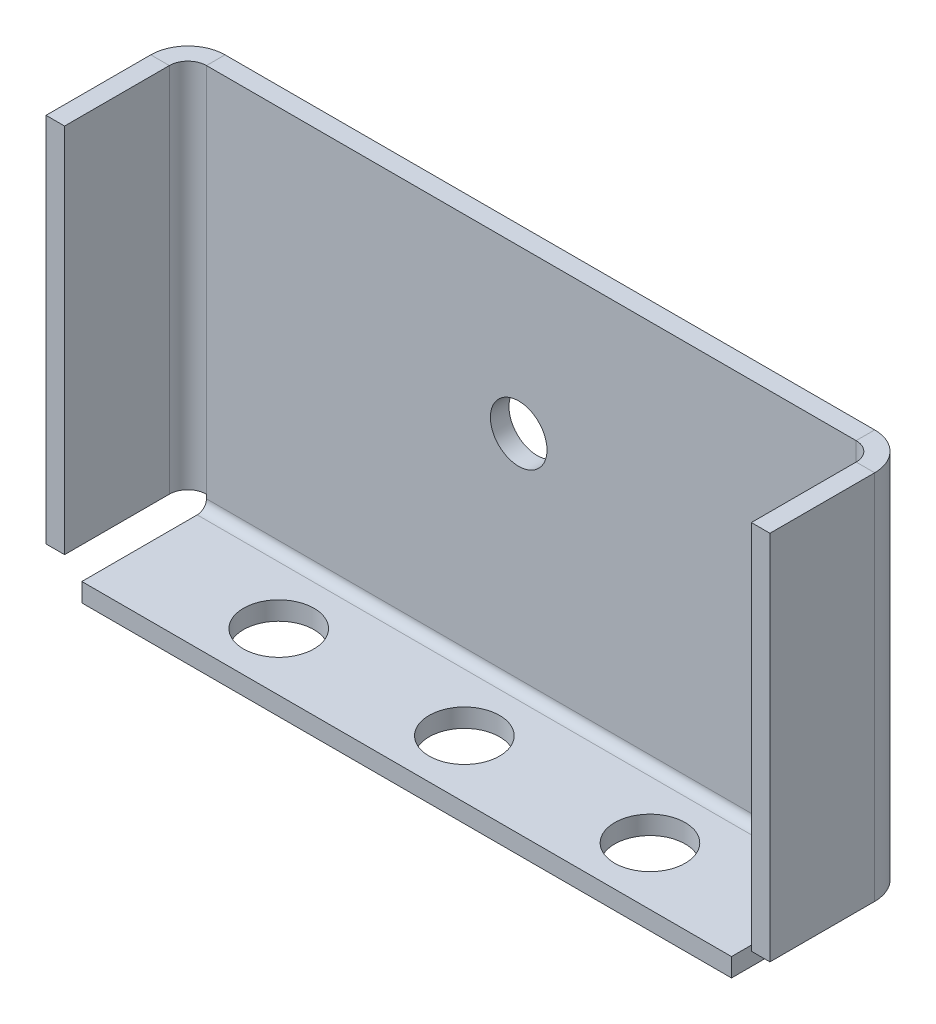
ISO-10303-21;
HEADER;
FILE_DESCRIPTION(('STEP AP214'),'2;1');
FILE_NAME('part.step','',(''),(''),'','','');
FILE_SCHEMA(('AUTOMOTIVE_DESIGN { 1 0 10303 214 1 1 1 1 }'));
ENDSEC;
DATA;
#1=APPLICATION_CONTEXT('core data for automotive mechanical design processes');
#2=APPLICATION_PROTOCOL_DEFINITION('international standard','automotive_design',2000,#1);
#3=PRODUCT_CONTEXT('',#1,'mechanical');
#4=PRODUCT('Part','Part','',(#3));
#5=PRODUCT_RELATED_PRODUCT_CATEGORY('part','',(#4));
#6=PRODUCT_DEFINITION_FORMATION('','',#4);
#7=PRODUCT_DEFINITION_CONTEXT('part definition',#1,'design');
#8=PRODUCT_DEFINITION('design','',#6,#7);
#9=PRODUCT_DEFINITION_SHAPE('','',#8);
#10=(LENGTH_UNIT() NAMED_UNIT(*) SI_UNIT(.MILLI.,.METRE.));
#11=(NAMED_UNIT(*) PLANE_ANGLE_UNIT() SI_UNIT($,.RADIAN.));
#12=(NAMED_UNIT(*) SI_UNIT($,.STERADIAN.) SOLID_ANGLE_UNIT());
#13=UNCERTAINTY_MEASURE_WITH_UNIT(LENGTH_MEASURE(1.E-05),#10,'distance_accuracy_value','');
#14=(GEOMETRIC_REPRESENTATION_CONTEXT(3) GLOBAL_UNCERTAINTY_ASSIGNED_CONTEXT((#13)) GLOBAL_UNIT_ASSIGNED_CONTEXT((#10,
#11,#12)) REPRESENTATION_CONTEXT('',''));
#15=CARTESIAN_POINT('',(0.,0.,0.));
#16=DIRECTION('',(0.,0.,1.));
#17=DIRECTION('',(1.,0.,0.));
#18=AXIS2_PLACEMENT_3D('',#15,#16,#17);
#19=CARTESIAN_POINT('',(0.,0.,-1.));
#20=DIRECTION('',(0.,0.,1.));
#21=DIRECTION('',(1.,0.,0.));
#22=AXIS2_PLACEMENT_3D('',#19,#20,#21);
#23=PLANE('',#22);
#24=CARTESIAN_POINT('',(-0.679999999999993,1.23539816339747,-0.999999999999999));
#25=DIRECTION('',(0.,0.,1.));
#26=DIRECTION('',(1.,0.,0.));
#27=AXIS2_PLACEMENT_3D('',#24,#25,#26);
#28=CIRCLE('',#27,1.525);
#29=CARTESIAN_POINT('',(0.845000000000007,1.23539816339747,-0.999999999999999));
#30=VERTEX_POINT('',#29);
#31=EDGE_CURVE('E432',#30,#30,#28,.T.);
#32=ORIENTED_EDGE('',*,*,#31,.T.);
#33=EDGE_LOOP('',(#32));
#34=FACE_BOUND('',#33,.T.);
#35=DIRECTION('',(0.,1.,0.));
#36=VECTOR('',#35,1.);
#37=CARTESIAN_POINT('',(17.5,-10.,-1.));
#38=LINE('',#37,#36);
#39=CARTESIAN_POINT('',(17.5,-10.2146018366026,-1.));
#40=VERTEX_POINT('',#39);
#41=CARTESIAN_POINT('',(17.5,-9.99999999999999,-1.));
#42=VERTEX_POINT('',#41);
#43=EDGE_CURVE('E53',#40,#42,#38,.T.);
#44=ORIENTED_EDGE('',*,*,#43,.F.);
#45=DIRECTION('',(-1.,0.,0.));
#46=VECTOR('',#45,1.);
#47=CARTESIAN_POINT('',(0.,-10.2146018366025,-1.));
#48=LINE('',#47,#46);
#49=CARTESIAN_POINT('',(-17.5,-10.2146018366026,-1.));
#50=VERTEX_POINT('',#49);
#51=EDGE_CURVE('E325',#40,#50,#48,.T.);
#52=ORIENTED_EDGE('',*,*,#51,.T.);
#53=DIRECTION('',(0.,-1.,0.));
#54=VECTOR('',#53,1.);
#55=CARTESIAN_POINT('',(-17.5,-10.,-1.));
#56=LINE('',#55,#54);
#57=CARTESIAN_POINT('',(-17.5,-10.,-1.));
#58=VERTEX_POINT('',#57);
#59=EDGE_CURVE('E331',#58,#50,#56,.T.);
#60=ORIENTED_EDGE('',*,*,#59,.F.);
#61=DIRECTION('',(0.,-1.,0.));
#62=VECTOR('',#61,1.);
#63=CARTESIAN_POINT('',(-17.5,0.,-1.));
#64=LINE('',#63,#62);
#65=CARTESIAN_POINT('',(-17.5,9.99999999999999,-1.));
#66=VERTEX_POINT('',#65);
#67=EDGE_CURVE('E306',#66,#58,#64,.T.);
#68=ORIENTED_EDGE('',*,*,#67,.F.);
#69=DIRECTION('',(-1.,0.,0.));
#70=VECTOR('',#69,1.);
#71=CARTESIAN_POINT('',(-25.5,10.,-1.));
#72=LINE('',#71,#70);
#73=CARTESIAN_POINT('',(17.5,10.,-1.));
#74=VERTEX_POINT('',#73);
#75=EDGE_CURVE('E328',#74,#66,#72,.T.);
#76=ORIENTED_EDGE('',*,*,#75,.F.);
#77=DIRECTION('',(0.,-1.,0.));
#78=VECTOR('',#77,1.);
#79=CARTESIAN_POINT('',(17.5,0.,-1.));
#80=LINE('',#79,#78);
#81=EDGE_CURVE('E315',#74,#42,#80,.T.);
#82=ORIENTED_EDGE('',*,*,#81,.T.);
#83=EDGE_LOOP('',(#44,#52,#60,#68,#76,#82));
#84=FACE_BOUND('',#83,.T.);
#85=ADVANCED_FACE('F49',(#34,#84),#23,.F.);
#86=CARTESIAN_POINT('',(0.,0.,0.));
#87=DIRECTION('',(0.,0.,1.));
#88=DIRECTION('',(1.,0.,0.));
#89=AXIS2_PLACEMENT_3D('',#86,#87,#88);
#90=PLANE('',#89);
#91=CARTESIAN_POINT('',(-0.679999999999993,1.23539816339747,0.));
#92=DIRECTION('',(0.,0.,1.));
#93=DIRECTION('',(1.,0.,0.));
#94=AXIS2_PLACEMENT_3D('',#91,#92,#93);
#95=CIRCLE('',#94,1.525);
#96=CARTESIAN_POINT('',(0.845000000000007,1.23539816339747,0.));
#97=VERTEX_POINT('',#96);
#98=EDGE_CURVE('E435',#97,#97,#95,.T.);
#99=ORIENTED_EDGE('',*,*,#98,.F.);
#100=EDGE_LOOP('',(#99));
#101=FACE_BOUND('',#100,.T.);
#102=DIRECTION('',(-1.,0.,0.));
#103=VECTOR('',#102,1.);
#104=CARTESIAN_POINT('',(0.,-10.2146018366026,0.));
#105=LINE('',#104,#103);
#106=CARTESIAN_POINT('',(17.5,-10.2146018366026,0.));
#107=VERTEX_POINT('',#106);
#108=CARTESIAN_POINT('',(-17.5,-10.2146018366026,0.));
#109=VERTEX_POINT('',#108);
#110=EDGE_CURVE('E58',#107,#109,#105,.T.);
#111=ORIENTED_EDGE('',*,*,#110,.F.);
#112=DIRECTION('',(0.,1.,0.));
#113=VECTOR('',#112,1.);
#114=CARTESIAN_POINT('',(17.5,-10.,0.));
#115=LINE('',#114,#113);
#116=CARTESIAN_POINT('',(17.5,-10.,0.));
#117=VERTEX_POINT('',#116);
#118=EDGE_CURVE('E74',#107,#117,#115,.T.);
#119=ORIENTED_EDGE('',*,*,#118,.T.);
#120=DIRECTION('',(0.,-1.,0.));
#121=VECTOR('',#120,1.);
#122=CARTESIAN_POINT('',(17.5,0.,0.));
#123=LINE('',#122,#121);
#124=CARTESIAN_POINT('',(17.5,10.,0.));
#125=VERTEX_POINT('',#124);
#126=EDGE_CURVE('E320',#125,#117,#123,.T.);
#127=ORIENTED_EDGE('',*,*,#126,.F.);
#128=DIRECTION('',(-1.,0.,0.));
#129=VECTOR('',#128,1.);
#130=CARTESIAN_POINT('',(-25.5,10.,0.));
#131=LINE('',#130,#129);
#132=CARTESIAN_POINT('',(-17.5,10.,0.));
#133=VERTEX_POINT('',#132);
#134=EDGE_CURVE('E302',#125,#133,#131,.T.);
#135=ORIENTED_EDGE('',*,*,#134,.T.);
#136=DIRECTION('',(0.,-1.,0.));
#137=VECTOR('',#136,1.);
#138=CARTESIAN_POINT('',(-17.5,0.,0.));
#139=LINE('',#138,#137);
#140=CARTESIAN_POINT('',(-17.5,-10.,0.));
#141=VERTEX_POINT('',#140);
#142=EDGE_CURVE('E310',#133,#141,#139,.T.);
#143=ORIENTED_EDGE('',*,*,#142,.T.);
#144=DIRECTION('',(0.,-1.,0.));
#145=VECTOR('',#144,1.);
#146=CARTESIAN_POINT('',(-17.5,-10.,0.));
#147=LINE('',#146,#145);
#148=EDGE_CURVE('E66',#141,#109,#147,.T.);
#149=ORIENTED_EDGE('',*,*,#148,.T.);
#150=EDGE_LOOP('',(#111,#119,#127,#135,#143,#149));
#151=FACE_BOUND('',#150,.T.);
#152=ADVANCED_FACE('F341',(#101,#151),#90,.T.);
#153=CARTESIAN_POINT('',(-25.5,10.,-1.));
#154=DIRECTION('',(0.,1.,0.));
#155=DIRECTION('',(0.,0.,1.));
#156=AXIS2_PLACEMENT_3D('',#153,#154,#155);
#157=PLANE('',#156);
#158=DIRECTION('',(0.,0.,1.));
#159=VECTOR('',#158,1.);
#160=CARTESIAN_POINT('',(17.5,10.,-1.));
#161=LINE('',#160,#159);
#162=EDGE_CURVE('E318',#74,#125,#161,.T.);
#163=ORIENTED_EDGE('',*,*,#162,.F.);
#164=ORIENTED_EDGE('',*,*,#75,.T.);
#165=DIRECTION('',(0.,0.,1.));
#166=VECTOR('',#165,1.);
#167=CARTESIAN_POINT('',(-17.5,10.,-1.));
#168=LINE('',#167,#166);
#169=EDGE_CURVE('E312',#66,#133,#168,.T.);
#170=ORIENTED_EDGE('',*,*,#169,.T.);
#171=ORIENTED_EDGE('',*,*,#134,.F.);
#172=EDGE_LOOP('',(#163,#164,#170,#171));
#173=FACE_BOUND('',#172,.T.);
#174=ADVANCED_FACE('F376',(#173),#157,.T.);
#175=CARTESIAN_POINT('',(17.5,-10.,-1.));
#176=DIRECTION('',(1.,0.,0.));
#177=DIRECTION('',(0.,1.,0.));
#178=AXIS2_PLACEMENT_3D('',#175,#176,#177);
#179=PLANE('',#178);
#180=DIRECTION('',(0.,0.,1.));
#181=VECTOR('',#180,1.);
#182=CARTESIAN_POINT('',(17.5,-10.2146018366025,-1.));
#183=LINE('',#182,#181);
#184=EDGE_CURVE('E334',#40,#107,#183,.T.);
#185=ORIENTED_EDGE('',*,*,#184,.F.);
#186=ORIENTED_EDGE('',*,*,#43,.T.);
#187=DIRECTION('',(0.,0.,1.));
#188=VECTOR('',#187,1.);
#189=CARTESIAN_POINT('',(17.5,-10.,-1.));
#190=LINE('',#189,#188);
#191=EDGE_CURVE('E323',#42,#117,#190,.T.);
#192=ORIENTED_EDGE('',*,*,#191,.T.);
#193=ORIENTED_EDGE('',*,*,#118,.F.);
#194=EDGE_LOOP('',(#185,#186,#192,#193));
#195=FACE_BOUND('',#194,.T.);
#196=ADVANCED_FACE('F353',(#195),#179,.T.);
#197=CARTESIAN_POINT('',(-17.5,-10.,-1.));
#198=DIRECTION('',(-1.,0.,0.));
#199=DIRECTION('',(0.,-1.,0.));
#200=AXIS2_PLACEMENT_3D('',#197,#198,#199);
#201=PLANE('',#200);
#202=DIRECTION('',(0.,0.,-1.));
#203=VECTOR('',#202,1.);
#204=CARTESIAN_POINT('',(-17.5,-10.2146018366025,-1.));
#205=LINE('',#204,#203);
#206=EDGE_CURVE('E12',#109,#50,#205,.T.);
#207=ORIENTED_EDGE('',*,*,#206,.F.);
#208=ORIENTED_EDGE('',*,*,#148,.F.);
#209=DIRECTION('',(0.,0.,1.));
#210=VECTOR('',#209,1.);
#211=CARTESIAN_POINT('',(-17.5,-10.,-1.));
#212=LINE('',#211,#210);
#213=EDGE_CURVE('E308',#58,#141,#212,.T.);
#214=ORIENTED_EDGE('',*,*,#213,.F.);
#215=ORIENTED_EDGE('',*,*,#59,.T.);
#216=EDGE_LOOP('',(#207,#208,#214,#215));
#217=FACE_BOUND('',#216,.T.);
#218=ADVANCED_FACE('F51',(#217),#201,.T.);
#219=CARTESIAN_POINT('',(-17.5,9.99999999999999,1.));
#220=DIRECTION('',(0.,1.,0.));
#221=DIRECTION('',(0.,0.,1.));
#222=AXIS2_PLACEMENT_3D('',#219,#220,#221);
#223=PLANE('',#222);
#224=DIRECTION('',(1.,0.,0.));
#225=VECTOR('',#224,1.);
#226=CARTESIAN_POINT('',(-19.5,10.,1.00000000000001));
#227=LINE('',#226,#225);
#228=CARTESIAN_POINT('',(-19.5,9.99999999999999,1.00000000000001));
#229=VERTEX_POINT('',#228);
#230=CARTESIAN_POINT('',(-18.5,10.,1.));
#231=VERTEX_POINT('',#230);
#232=EDGE_CURVE('E259',#229,#231,#227,.T.);
#233=ORIENTED_EDGE('',*,*,#232,.T.);
#234=CARTESIAN_POINT('',(-17.5,9.99999999999998,1.));
#235=DIRECTION('',(0.,1.,0.));
#236=DIRECTION('',(0.,0.,1.));
#237=AXIS2_PLACEMENT_3D('',#234,#235,#236);
#238=CIRCLE('',#237,1.);
#239=EDGE_CURVE('E267',#231,#133,#238,.F.);
#240=ORIENTED_EDGE('',*,*,#239,.T.);
#241=ORIENTED_EDGE('',*,*,#169,.F.);
#242=CARTESIAN_POINT('',(-17.5,9.99999999999999,1.));
#243=DIRECTION('',(0.,-1.,0.));
#244=DIRECTION('',(0.,0.,1.));
#245=AXIS2_PLACEMENT_3D('',#242,#243,#244);
#246=CIRCLE('',#245,2.);
#247=EDGE_CURVE('E295',#229,#66,#246,.T.);
#248=ORIENTED_EDGE('',*,*,#247,.F.);
#249=EDGE_LOOP('',(#233,#240,#241,#248));
#250=FACE_BOUND('',#249,.T.);
#251=ADVANCED_FACE('F457',(#250),#223,.T.);
#252=CARTESIAN_POINT('',(-17.5,-10.,1.));
#253=DIRECTION('',(0.,-1.,0.));
#254=DIRECTION('',(0.,0.,-1.));
#255=AXIS2_PLACEMENT_3D('',#252,#253,#254);
#256=PLANE('',#255);
#257=CARTESIAN_POINT('',(-17.5,-10.,1.));
#258=DIRECTION('',(0.,1.,0.));
#259=DIRECTION('',(0.,0.,1.));
#260=AXIS2_PLACEMENT_3D('',#257,#258,#259);
#261=CIRCLE('',#260,1.);
#262=CARTESIAN_POINT('',(-18.5,-10.,1.));
#263=VERTEX_POINT('',#262);
#264=EDGE_CURVE('E299',#141,#263,#261,.T.);
#265=ORIENTED_EDGE('',*,*,#264,.T.);
#266=DIRECTION('',(-1.,0.,0.));
#267=VECTOR('',#266,1.);
#268=CARTESIAN_POINT('',(-19.5,-10.,1.00000000000001));
#269=LINE('',#268,#267);
#270=CARTESIAN_POINT('',(-19.5,-10.,1.00000000000001));
#271=VERTEX_POINT('',#270);
#272=EDGE_CURVE('E287',#263,#271,#269,.T.);
#273=ORIENTED_EDGE('',*,*,#272,.T.);
#274=CARTESIAN_POINT('',(-17.5,-10.,1.));
#275=DIRECTION('',(0.,1.,0.));
#276=DIRECTION('',(0.,0.,-1.));
#277=AXIS2_PLACEMENT_3D('',#274,#275,#276);
#278=CIRCLE('',#277,2.);
#279=EDGE_CURVE('E298',#58,#271,#278,.T.);
#280=ORIENTED_EDGE('',*,*,#279,.F.);
#281=ORIENTED_EDGE('',*,*,#213,.T.);
#282=EDGE_LOOP('',(#265,#273,#280,#281));
#283=FACE_BOUND('',#282,.T.);
#284=ADVANCED_FACE('F453',(#283),#256,.T.);
#285=CARTESIAN_POINT('',(-17.5,-20.1631260591113,1.));
#286=DIRECTION('',(0.,1.,0.));
#287=DIRECTION('',(0.,0.,1.));
#288=AXIS2_PLACEMENT_3D('',#285,#286,#287);
#289=CYLINDRICAL_SURFACE('',#288,2.);
#290=ORIENTED_EDGE('',*,*,#67,.T.);
#291=ORIENTED_EDGE('',*,*,#279,.T.);
#292=DIRECTION('',(0.,-1.,0.));
#293=VECTOR('',#292,1.);
#294=CARTESIAN_POINT('',(-19.5,0.,1.00000000000001));
#295=LINE('',#294,#293);
#296=EDGE_CURVE('E280',#229,#271,#295,.T.);
#297=ORIENTED_EDGE('',*,*,#296,.F.);
#298=ORIENTED_EDGE('',*,*,#247,.T.);
#299=EDGE_LOOP('',(#290,#291,#297,#298));
#300=FACE_BOUND('',#299,.T.);
#301=ADVANCED_FACE('F456',(#300),#289,.T.);
#302=CARTESIAN_POINT('',(-17.5,-20.1631260591113,1.));
#303=DIRECTION('',(0.,1.,0.));
#304=DIRECTION('',(0.,0.,1.));
#305=AXIS2_PLACEMENT_3D('',#302,#303,#304);
#306=CYLINDRICAL_SURFACE('',#305,1.);
#307=ORIENTED_EDGE('',*,*,#142,.F.);
#308=ORIENTED_EDGE('',*,*,#239,.F.);
#309=DIRECTION('',(0.,-1.,0.));
#310=VECTOR('',#309,1.);
#311=CARTESIAN_POINT('',(-18.5,0.,1.));
#312=LINE('',#311,#310);
#313=EDGE_CURVE('E290',#231,#263,#312,.T.);
#314=ORIENTED_EDGE('',*,*,#313,.T.);
#315=ORIENTED_EDGE('',*,*,#264,.F.);
#316=EDGE_LOOP('',(#307,#308,#314,#315));
#317=FACE_BOUND('',#316,.T.);
#318=ADVANCED_FACE('F381',(#317),#306,.F.);
#319=CARTESIAN_POINT('',(-19.5,10.,6.64380550980765));
#320=DIRECTION('',(0.,0.,1.));
#321=DIRECTION('',(0.,-1.,0.));
#322=AXIS2_PLACEMENT_3D('',#319,#320,#321);
#323=PLANE('',#322);
#324=DIRECTION('',(0.,-1.,0.));
#325=VECTOR('',#324,1.);
#326=CARTESIAN_POINT('',(-18.5,10.,6.64380550980765));
#327=LINE('',#326,#325);
#328=CARTESIAN_POINT('',(-18.5,10.,6.64380550980765));
#329=VERTEX_POINT('',#328);
#330=CARTESIAN_POINT('',(-18.5,-10.,6.64380550980764));
#331=VERTEX_POINT('',#330);
#332=EDGE_CURVE('E272',#329,#331,#327,.T.);
#333=ORIENTED_EDGE('',*,*,#332,.F.);
#334=DIRECTION('',(1.,0.,0.));
#335=VECTOR('',#334,1.);
#336=CARTESIAN_POINT('',(-19.5,10.,6.64380550980765));
#337=LINE('',#336,#335);
#338=CARTESIAN_POINT('',(-19.5,10.,6.64380550980765));
#339=VERTEX_POINT('',#338);
#340=EDGE_CURVE('E264',#339,#329,#337,.T.);
#341=ORIENTED_EDGE('',*,*,#340,.F.);
#342=DIRECTION('',(0.,-1.,0.));
#343=VECTOR('',#342,1.);
#344=CARTESIAN_POINT('',(-19.5,10.,6.64380550980765));
#345=LINE('',#344,#343);
#346=CARTESIAN_POINT('',(-19.5,-10.,6.64380550980764));
#347=VERTEX_POINT('',#346);
#348=EDGE_CURVE('E284',#339,#347,#345,.T.);
#349=ORIENTED_EDGE('',*,*,#348,.T.);
#350=DIRECTION('',(1.,0.,0.));
#351=VECTOR('',#350,1.);
#352=CARTESIAN_POINT('',(-19.5,-10.,6.64380550980764));
#353=LINE('',#352,#351);
#354=EDGE_CURVE('E282',#347,#331,#353,.T.);
#355=ORIENTED_EDGE('',*,*,#354,.T.);
#356=EDGE_LOOP('',(#333,#341,#349,#355));
#357=FACE_BOUND('',#356,.T.);
#358=ADVANCED_FACE('F463',(#357),#323,.T.);
#359=CARTESIAN_POINT('',(-19.5000000000001,0.,-18.8561944901923));
#360=DIRECTION('',(1.,0.,0.));
#361=DIRECTION('',(0.,0.,-1.));
#362=AXIS2_PLACEMENT_3D('',#359,#360,#361);
#363=PLANE('',#362);
#364=DIRECTION('',(0.,0.,1.));
#365=VECTOR('',#364,1.);
#366=CARTESIAN_POINT('',(-19.5,10.,6.64380550980765));
#367=LINE('',#366,#365);
#368=EDGE_CURVE('E268',#229,#339,#367,.T.);
#369=ORIENTED_EDGE('',*,*,#368,.F.);
#370=ORIENTED_EDGE('',*,*,#296,.T.);
#371=DIRECTION('',(0.,0.,-1.));
#372=VECTOR('',#371,1.);
#373=CARTESIAN_POINT('',(-19.5,-10.,6.64380550980764));
#374=LINE('',#373,#372);
#375=EDGE_CURVE('E277',#347,#271,#374,.T.);
#376=ORIENTED_EDGE('',*,*,#375,.F.);
#377=ORIENTED_EDGE('',*,*,#348,.F.);
#378=EDGE_LOOP('',(#369,#370,#376,#377));
#379=FACE_BOUND('',#378,.T.);
#380=ADVANCED_FACE('F478',(#379),#363,.F.);
#381=CARTESIAN_POINT('',(-19.5,-10.,6.64380550980764));
#382=DIRECTION('',(0.,-1.,0.));
#383=DIRECTION('',(0.,0.,-1.));
#384=AXIS2_PLACEMENT_3D('',#381,#382,#383);
#385=PLANE('',#384);
#386=ORIENTED_EDGE('',*,*,#272,.F.);
#387=DIRECTION('',(0.,0.,-1.));
#388=VECTOR('',#387,1.);
#389=CARTESIAN_POINT('',(-18.5,-10.,6.64380550980764));
#390=LINE('',#389,#388);
#391=EDGE_CURVE('E270',#331,#263,#390,.T.);
#392=ORIENTED_EDGE('',*,*,#391,.F.);
#393=ORIENTED_EDGE('',*,*,#354,.F.);
#394=ORIENTED_EDGE('',*,*,#375,.T.);
#395=EDGE_LOOP('',(#386,#392,#393,#394));
#396=FACE_BOUND('',#395,.T.);
#397=ADVANCED_FACE('F474',(#396),#385,.T.);
#398=CARTESIAN_POINT('',(-18.5000000000001,0.,-18.8561944901923));
#399=DIRECTION('',(1.,0.,0.));
#400=DIRECTION('',(0.,0.,-1.));
#401=AXIS2_PLACEMENT_3D('',#398,#399,#400);
#402=PLANE('',#401);
#403=ORIENTED_EDGE('',*,*,#313,.F.);
#404=DIRECTION('',(0.,0.,1.));
#405=VECTOR('',#404,1.);
#406=CARTESIAN_POINT('',(-18.5,10.,6.64380550980765));
#407=LINE('',#406,#405);
#408=EDGE_CURVE('E275',#231,#329,#407,.T.);
#409=ORIENTED_EDGE('',*,*,#408,.T.);
#410=ORIENTED_EDGE('',*,*,#332,.T.);
#411=ORIENTED_EDGE('',*,*,#391,.T.);
#412=EDGE_LOOP('',(#403,#409,#410,#411));
#413=FACE_BOUND('',#412,.T.);
#414=ADVANCED_FACE('F470',(#413),#402,.T.);
#415=CARTESIAN_POINT('',(-19.5,10.,6.64380550980765));
#416=DIRECTION('',(0.,1.,0.));
#417=DIRECTION('',(1.,0.,0.));
#418=AXIS2_PLACEMENT_3D('',#415,#416,#417);
#419=PLANE('',#418);
#420=ORIENTED_EDGE('',*,*,#232,.F.);
#421=ORIENTED_EDGE('',*,*,#368,.T.);
#422=ORIENTED_EDGE('',*,*,#340,.T.);
#423=ORIENTED_EDGE('',*,*,#408,.F.);
#424=EDGE_LOOP('',(#420,#421,#422,#423));
#425=FACE_BOUND('',#424,.T.);
#426=ADVANCED_FACE('F467',(#425),#419,.T.);
#427=CARTESIAN_POINT('',(17.5,10.,1.));
#428=DIRECTION('',(0.,1.,0.));
#429=DIRECTION('',(-1.,0.,0.));
#430=AXIS2_PLACEMENT_3D('',#427,#428,#429);
#431=PLANE('',#430);
#432=ORIENTED_EDGE('',*,*,#162,.T.);
#433=CARTESIAN_POINT('',(17.5,10.,1.));
#434=DIRECTION('',(0.,-1.,0.));
#435=DIRECTION('',(0.,0.,-1.));
#436=AXIS2_PLACEMENT_3D('',#433,#434,#435);
#437=CIRCLE('',#436,1.);
#438=CARTESIAN_POINT('',(18.5,10.,1.));
#439=VERTEX_POINT('',#438);
#440=EDGE_CURVE('E224',#125,#439,#437,.T.);
#441=ORIENTED_EDGE('',*,*,#440,.T.);
#442=DIRECTION('',(-1.,0.,0.));
#443=VECTOR('',#442,1.);
#444=CARTESIAN_POINT('',(19.5,10.,1.00000000000001));
#445=LINE('',#444,#443);
#446=CARTESIAN_POINT('',(19.5,10.,1.00000000000001));
#447=VERTEX_POINT('',#446);
#448=EDGE_CURVE('E239',#447,#439,#445,.T.);
#449=ORIENTED_EDGE('',*,*,#448,.F.);
#450=CARTESIAN_POINT('',(17.5,10.,1.));
#451=DIRECTION('',(0.,-1.,0.));
#452=DIRECTION('',(-1.,0.,0.));
#453=AXIS2_PLACEMENT_3D('',#450,#451,#452);
#454=CIRCLE('',#453,2.);
#455=EDGE_CURVE('E252',#74,#447,#454,.T.);
#456=ORIENTED_EDGE('',*,*,#455,.F.);
#457=EDGE_LOOP('',(#432,#441,#449,#456));
#458=FACE_BOUND('',#457,.T.);
#459=ADVANCED_FACE('F374',(#458),#431,.T.);
#460=CARTESIAN_POINT('',(17.5,-9.99999999999999,1.));
#461=DIRECTION('',(0.,-1.,0.));
#462=DIRECTION('',(0.,0.,-1.));
#463=AXIS2_PLACEMENT_3D('',#460,#461,#462);
#464=PLANE('',#463);
#465=DIRECTION('',(1.,0.,0.));
#466=VECTOR('',#465,1.);
#467=CARTESIAN_POINT('',(19.5,-10.,1.00000000000001));
#468=LINE('',#467,#466);
#469=CARTESIAN_POINT('',(18.5,-10.,1.));
#470=VERTEX_POINT('',#469);
#471=CARTESIAN_POINT('',(19.5,-10.,1.00000000000001));
#472=VERTEX_POINT('',#471);
#473=EDGE_CURVE('E227',#470,#472,#468,.T.);
#474=ORIENTED_EDGE('',*,*,#473,.F.);
#475=CARTESIAN_POINT('',(17.5,-9.99999999999999,1.));
#476=DIRECTION('',(0.,-1.,0.));
#477=DIRECTION('',(0.,0.,-1.));
#478=AXIS2_PLACEMENT_3D('',#475,#476,#477);
#479=CIRCLE('',#478,1.);
#480=EDGE_CURVE('E256',#470,#117,#479,.F.);
#481=ORIENTED_EDGE('',*,*,#480,.T.);
#482=ORIENTED_EDGE('',*,*,#191,.F.);
#483=CARTESIAN_POINT('',(17.5,-9.99999999999999,1.));
#484=DIRECTION('',(0.,1.,0.));
#485=DIRECTION('',(0.,0.,-1.));
#486=AXIS2_PLACEMENT_3D('',#483,#484,#485);
#487=CIRCLE('',#486,2.);
#488=EDGE_CURVE('E255',#472,#42,#487,.T.);
#489=ORIENTED_EDGE('',*,*,#488,.F.);
#490=EDGE_LOOP('',(#474,#481,#482,#489));
#491=FACE_BOUND('',#490,.T.);
#492=ADVANCED_FACE('F351',(#491),#464,.T.);
#493=CARTESIAN_POINT('',(17.5,20.1631260591113,1.));
#494=DIRECTION('',(0.,-1.,0.));
#495=DIRECTION('',(0.,0.,-1.));
#496=AXIS2_PLACEMENT_3D('',#493,#494,#495);
#497=CYLINDRICAL_SURFACE('',#496,2.);
#498=ORIENTED_EDGE('',*,*,#488,.T.);
#499=ORIENTED_EDGE('',*,*,#81,.F.);
#500=ORIENTED_EDGE('',*,*,#455,.T.);
#501=DIRECTION('',(0.,-1.,0.));
#502=VECTOR('',#501,1.);
#503=CARTESIAN_POINT('',(19.5,0.,1.00000000000001));
#504=LINE('',#503,#502);
#505=EDGE_CURVE('E216',#447,#472,#504,.T.);
#506=ORIENTED_EDGE('',*,*,#505,.T.);
#507=EDGE_LOOP('',(#498,#499,#500,#506));
#508=FACE_BOUND('',#507,.T.);
#509=ADVANCED_FACE('F363',(#508),#497,.T.);
#510=CARTESIAN_POINT('',(17.5,20.1631260591113,1.));
#511=DIRECTION('',(0.,-1.,0.));
#512=DIRECTION('',(0.,0.,-1.));
#513=AXIS2_PLACEMENT_3D('',#510,#511,#512);
#514=CYLINDRICAL_SURFACE('',#513,1.);
#515=ORIENTED_EDGE('',*,*,#480,.F.);
#516=DIRECTION('',(0.,-1.,0.));
#517=VECTOR('',#516,1.);
#518=CARTESIAN_POINT('',(18.5,0.,1.));
#519=LINE('',#518,#517);
#520=EDGE_CURVE('E234',#439,#470,#519,.T.);
#521=ORIENTED_EDGE('',*,*,#520,.F.);
#522=ORIENTED_EDGE('',*,*,#440,.F.);
#523=ORIENTED_EDGE('',*,*,#126,.T.);
#524=EDGE_LOOP('',(#515,#521,#522,#523));
#525=FACE_BOUND('',#524,.T.);
#526=ADVANCED_FACE('F345',(#525),#514,.F.);
#527=CARTESIAN_POINT('',(19.5,10.,6.64380550980766));
#528=DIRECTION('',(0.,0.,1.));
#529=DIRECTION('',(1.,0.,0.));
#530=AXIS2_PLACEMENT_3D('',#527,#528,#529);
#531=PLANE('',#530);
#532=DIRECTION('',(0.,1.,0.));
#533=VECTOR('',#532,1.);
#534=CARTESIAN_POINT('',(18.5,10.,6.64380550980766));
#535=LINE('',#534,#533);
#536=CARTESIAN_POINT('',(18.5,-10.,6.64380550980766));
#537=VERTEX_POINT('',#536);
#538=CARTESIAN_POINT('',(18.5,10.,6.64380550980766));
#539=VERTEX_POINT('',#538);
#540=EDGE_CURVE('E229',#537,#539,#535,.T.);
#541=ORIENTED_EDGE('',*,*,#540,.F.);
#542=DIRECTION('',(-1.,0.,0.));
#543=VECTOR('',#542,1.);
#544=CARTESIAN_POINT('',(19.5,-10.,6.64380550980766));
#545=LINE('',#544,#543);
#546=CARTESIAN_POINT('',(19.5,-10.,6.64380550980766));
#547=VERTEX_POINT('',#546);
#548=EDGE_CURVE('E221',#547,#537,#545,.T.);
#549=ORIENTED_EDGE('',*,*,#548,.F.);
#550=DIRECTION('',(0.,1.,0.));
#551=VECTOR('',#550,1.);
#552=CARTESIAN_POINT('',(19.5,10.,6.64380550980766));
#553=LINE('',#552,#551);
#554=CARTESIAN_POINT('',(19.5,10.,6.64380550980766));
#555=VERTEX_POINT('',#554);
#556=EDGE_CURVE('E247',#547,#555,#553,.T.);
#557=ORIENTED_EDGE('',*,*,#556,.T.);
#558=DIRECTION('',(-1.,0.,0.));
#559=VECTOR('',#558,1.);
#560=CARTESIAN_POINT('',(19.5,10.,6.64380550980766));
#561=LINE('',#560,#559);
#562=EDGE_CURVE('E245',#555,#539,#561,.T.);
#563=ORIENTED_EDGE('',*,*,#562,.T.);
#564=EDGE_LOOP('',(#541,#549,#557,#563));
#565=FACE_BOUND('',#564,.T.);
#566=ADVANCED_FACE('F492',(#565),#531,.T.);
#567=CARTESIAN_POINT('',(19.5000000000001,0.,-18.8561944901923));
#568=DIRECTION('',(-1.,0.,0.));
#569=DIRECTION('',(0.,0.,1.));
#570=AXIS2_PLACEMENT_3D('',#567,#568,#569);
#571=PLANE('',#570);
#572=ORIENTED_EDGE('',*,*,#505,.F.);
#573=DIRECTION('',(0.,0.,-1.));
#574=VECTOR('',#573,1.);
#575=CARTESIAN_POINT('',(19.5000000000002,10.,-44.3561944901923));
#576=LINE('',#575,#574);
#577=EDGE_CURVE('E242',#555,#447,#576,.T.);
#578=ORIENTED_EDGE('',*,*,#577,.F.);
#579=ORIENTED_EDGE('',*,*,#556,.F.);
#580=DIRECTION('',(0.,0.,1.));
#581=VECTOR('',#580,1.);
#582=CARTESIAN_POINT('',(19.5,-10.,-1.35619449019234));
#583=LINE('',#582,#581);
#584=EDGE_CURVE('E225',#472,#547,#583,.T.);
#585=ORIENTED_EDGE('',*,*,#584,.F.);
#586=EDGE_LOOP('',(#572,#578,#579,#585));
#587=FACE_BOUND('',#586,.T.);
#588=ADVANCED_FACE('F367',(#587),#571,.F.);
#589=CARTESIAN_POINT('',(19.5000000000002,10.,-44.3561944901923));
#590=DIRECTION('',(0.,1.,0.));
#591=DIRECTION('',(-1.,0.,0.));
#592=AXIS2_PLACEMENT_3D('',#589,#590,#591);
#593=PLANE('',#592);
#594=ORIENTED_EDGE('',*,*,#577,.T.);
#595=ORIENTED_EDGE('',*,*,#448,.T.);
#596=DIRECTION('',(0.,0.,-1.));
#597=VECTOR('',#596,1.);
#598=CARTESIAN_POINT('',(18.5000000000002,10.,-44.3561944901923));
#599=LINE('',#598,#597);
#600=EDGE_CURVE('E237',#539,#439,#599,.T.);
#601=ORIENTED_EDGE('',*,*,#600,.F.);
#602=ORIENTED_EDGE('',*,*,#562,.F.);
#603=EDGE_LOOP('',(#594,#595,#601,#602));
#604=FACE_BOUND('',#603,.T.);
#605=ADVANCED_FACE('F371',(#604),#593,.T.);
#606=CARTESIAN_POINT('',(18.5000000000001,0.,-18.8561944901923));
#607=DIRECTION('',(-1.,0.,0.));
#608=DIRECTION('',(0.,0.,1.));
#609=AXIS2_PLACEMENT_3D('',#606,#607,#608);
#610=PLANE('',#609);
#611=ORIENTED_EDGE('',*,*,#600,.T.);
#612=ORIENTED_EDGE('',*,*,#520,.T.);
#613=DIRECTION('',(0.,0.,1.));
#614=VECTOR('',#613,1.);
#615=CARTESIAN_POINT('',(18.5,-10.,-1.35619449019235));
#616=LINE('',#615,#614);
#617=EDGE_CURVE('E232',#470,#537,#616,.T.);
#618=ORIENTED_EDGE('',*,*,#617,.T.);
#619=ORIENTED_EDGE('',*,*,#540,.T.);
#620=EDGE_LOOP('',(#611,#612,#618,#619));
#621=FACE_BOUND('',#620,.T.);
#622=ADVANCED_FACE('F498',(#621),#610,.T.);
#623=CARTESIAN_POINT('',(19.5,-10.,-1.35619449019234));
#624=DIRECTION('',(0.,-1.,0.));
#625=DIRECTION('',(0.,0.,1.));
#626=AXIS2_PLACEMENT_3D('',#623,#624,#625);
#627=PLANE('',#626);
#628=ORIENTED_EDGE('',*,*,#617,.F.);
#629=ORIENTED_EDGE('',*,*,#473,.T.);
#630=ORIENTED_EDGE('',*,*,#584,.T.);
#631=ORIENTED_EDGE('',*,*,#548,.T.);
#632=EDGE_LOOP('',(#628,#629,#630,#631));
#633=FACE_BOUND('',#632,.T.);
#634=ADVANCED_FACE('F495',(#633),#627,.T.);
#635=CARTESIAN_POINT('',(17.5,-10.2146018366025,0.5));
#636=DIRECTION('',(1.,0.,0.));
#637=DIRECTION('',(0.,0.,-1.));
#638=AXIS2_PLACEMENT_3D('',#635,#636,#637);
#639=PLANE('',#638);
#640=ORIENTED_EDGE('',*,*,#184,.T.);
#641=CARTESIAN_POINT('',(17.5,-10.2146018366025,0.5));
#642=DIRECTION('',(-1.,0.,0.));
#643=DIRECTION('',(0.,0.,1.));
#644=AXIS2_PLACEMENT_3D('',#641,#642,#643);
#645=CIRCLE('',#644,0.5);
#646=CARTESIAN_POINT('',(17.5,-10.7146018366025,0.500000000000009));
#647=VERTEX_POINT('',#646);
#648=EDGE_CURVE('E195',#107,#647,#645,.T.);
#649=ORIENTED_EDGE('',*,*,#648,.T.);
#650=DIRECTION('',(0.,1.,0.));
#651=VECTOR('',#650,1.);
#652=CARTESIAN_POINT('',(17.5,-11.7146018366026,0.500000000000006));
#653=LINE('',#652,#651);
#654=CARTESIAN_POINT('',(17.5,-11.7146018366025,0.500000000000006));
#655=VERTEX_POINT('',#654);
#656=EDGE_CURVE('E400',#655,#647,#653,.T.);
#657=ORIENTED_EDGE('',*,*,#656,.F.);
#658=CARTESIAN_POINT('',(17.5,-10.2146018366025,0.5));
#659=DIRECTION('',(-1.,0.,0.));
#660=DIRECTION('',(0.,0.,-1.));
#661=AXIS2_PLACEMENT_3D('',#658,#659,#660);
#662=CIRCLE('',#661,1.5);
#663=EDGE_CURVE('E209',#40,#655,#662,.T.);
#664=ORIENTED_EDGE('',*,*,#663,.F.);
#665=EDGE_LOOP('',(#640,#649,#657,#664));
#666=FACE_BOUND('',#665,.T.);
#667=ADVANCED_FACE('F398',(#666),#639,.T.);
#668=CARTESIAN_POINT('',(-17.5,-10.2146018366025,0.5));
#669=DIRECTION('',(-1.,0.,0.));
#670=DIRECTION('',(0.,0.,1.));
#671=AXIS2_PLACEMENT_3D('',#668,#669,#670);
#672=PLANE('',#671);
#673=DIRECTION('',(0.,-1.,0.));
#674=VECTOR('',#673,1.);
#675=CARTESIAN_POINT('',(-17.5,-11.7146018366026,0.500000000000006));
#676=LINE('',#675,#674);
#677=CARTESIAN_POINT('',(-17.5,-10.7146018366025,0.500000000000009));
#678=VERTEX_POINT('',#677);
#679=CARTESIAN_POINT('',(-17.5,-11.7146018366025,0.499999999999999));
#680=VERTEX_POINT('',#679);
#681=EDGE_CURVE('E184',#678,#680,#676,.T.);
#682=ORIENTED_EDGE('',*,*,#681,.F.);
#683=CARTESIAN_POINT('',(-17.5,-10.2146018366025,0.5));
#684=DIRECTION('',(-1.,0.,0.));
#685=DIRECTION('',(0.,0.,1.));
#686=AXIS2_PLACEMENT_3D('',#683,#684,#685);
#687=CIRCLE('',#686,0.5);
#688=EDGE_CURVE('E213',#678,#109,#687,.F.);
#689=ORIENTED_EDGE('',*,*,#688,.T.);
#690=ORIENTED_EDGE('',*,*,#206,.T.);
#691=CARTESIAN_POINT('',(-17.5,-10.2146018366025,0.5));
#692=DIRECTION('',(1.,0.,0.));
#693=DIRECTION('',(0.,0.,1.));
#694=AXIS2_PLACEMENT_3D('',#691,#692,#693);
#695=CIRCLE('',#694,1.5);
#696=EDGE_CURVE('E212',#680,#50,#695,.T.);
#697=ORIENTED_EDGE('',*,*,#696,.F.);
#698=EDGE_LOOP('',(#682,#689,#690,#697));
#699=FACE_BOUND('',#698,.T.);
#700=ADVANCED_FACE('F389',(#699),#672,.T.);
#701=CARTESIAN_POINT('',(35.0494992988527,-10.2146018366025,0.5));
#702=DIRECTION('',(-1.,0.,0.));
#703=DIRECTION('',(0.,0.,1.));
#704=AXIS2_PLACEMENT_3D('',#701,#702,#703);
#705=CYLINDRICAL_SURFACE('',#704,1.5);
#706=ORIENTED_EDGE('',*,*,#696,.T.);
#707=ORIENTED_EDGE('',*,*,#51,.F.);
#708=ORIENTED_EDGE('',*,*,#663,.T.);
#709=DIRECTION('',(-1.,0.,0.));
#710=VECTOR('',#709,1.);
#711=CARTESIAN_POINT('',(0.,-11.7146018366025,0.500000000000006));
#712=LINE('',#711,#710);
#713=EDGE_CURVE('E202',#655,#680,#712,.T.);
#714=ORIENTED_EDGE('',*,*,#713,.T.);
#715=EDGE_LOOP('',(#706,#707,#708,#714));
#716=FACE_BOUND('',#715,.T.);
#717=ADVANCED_FACE('F402',(#716),#705,.T.);
#718=CARTESIAN_POINT('',(35.0494992988527,-10.2146018366025,0.5));
#719=DIRECTION('',(-1.,0.,0.));
#720=DIRECTION('',(0.,0.,1.));
#721=AXIS2_PLACEMENT_3D('',#718,#719,#720);
#722=CYLINDRICAL_SURFACE('',#721,0.5);
#723=ORIENTED_EDGE('',*,*,#688,.F.);
#724=DIRECTION('',(-1.,0.,0.));
#725=VECTOR('',#724,1.);
#726=CARTESIAN_POINT('',(0.,-10.7146018366025,0.500000000000009));
#727=LINE('',#726,#725);
#728=EDGE_CURVE('E395',#647,#678,#727,.T.);
#729=ORIENTED_EDGE('',*,*,#728,.F.);
#730=ORIENTED_EDGE('',*,*,#648,.F.);
#731=ORIENTED_EDGE('',*,*,#110,.T.);
#732=EDGE_LOOP('',(#723,#729,#730,#731));
#733=FACE_BOUND('',#732,.T.);
#734=ADVANCED_FACE('F393',(#733),#722,.F.);
#735=CARTESIAN_POINT('',(-17.5,-11.7146018366025,6.71460183660256));
#736=DIRECTION('',(0.,0.,1.));
#737=DIRECTION('',(0.,-1.,0.));
#738=AXIS2_PLACEMENT_3D('',#735,#736,#737);
#739=PLANE('',#738);
#740=DIRECTION('',(1.,0.,0.));
#741=VECTOR('',#740,1.);
#742=CARTESIAN_POINT('',(-17.5,-10.7146018366025,6.71460183660255));
#743=LINE('',#742,#741);
#744=CARTESIAN_POINT('',(-17.5,-10.7146018366025,6.71460183660255));
#745=VERTEX_POINT('',#744);
#746=CARTESIAN_POINT('',(17.5,-10.7146018366025,6.71460183660255));
#747=VERTEX_POINT('',#746);
#748=EDGE_CURVE('E194',#745,#747,#743,.T.);
#749=ORIENTED_EDGE('',*,*,#748,.F.);
#750=DIRECTION('',(0.,1.,0.));
#751=VECTOR('',#750,1.);
#752=CARTESIAN_POINT('',(-17.5,-11.7146018366025,6.71460183660256));
#753=LINE('',#752,#751);
#754=CARTESIAN_POINT('',(-17.5,-11.7146018366025,6.71460183660256));
#755=VERTEX_POINT('',#754);
#756=EDGE_CURVE('E181',#755,#745,#753,.T.);
#757=ORIENTED_EDGE('',*,*,#756,.F.);
#758=DIRECTION('',(1.,0.,0.));
#759=VECTOR('',#758,1.);
#760=CARTESIAN_POINT('',(-17.5,-11.7146018366025,6.71460183660256));
#761=LINE('',#760,#759);
#762=CARTESIAN_POINT('',(17.5,-11.7146018366025,6.71460183660256));
#763=VERTEX_POINT('',#762);
#764=EDGE_CURVE('E192',#755,#763,#761,.T.);
#765=ORIENTED_EDGE('',*,*,#764,.T.);
#766=DIRECTION('',(0.,1.,0.));
#767=VECTOR('',#766,1.);
#768=CARTESIAN_POINT('',(17.5,-11.7146018366025,6.71460183660256));
#769=LINE('',#768,#767);
#770=EDGE_CURVE('E201',#763,#747,#769,.T.);
#771=ORIENTED_EDGE('',*,*,#770,.T.);
#772=EDGE_LOOP('',(#749,#757,#765,#771));
#773=FACE_BOUND('',#772,.T.);
#774=ADVANCED_FACE('F191',(#773),#739,.T.);
#775=CARTESIAN_POINT('',(0.,-11.7146018366026,-11.2853981633974));
#776=DIRECTION('',(0.,1.,0.));
#777=DIRECTION('',(1.,0.,0.));
#778=AXIS2_PLACEMENT_3D('',#775,#776,#777);
#779=PLANE('',#778);
#780=CARTESIAN_POINT('',(-10.,-11.7146018366026,3.60730091830128));
#781=DIRECTION('',(0.,1.,0.));
#782=DIRECTION('',(0.,0.,1.));
#783=AXIS2_PLACEMENT_3D('',#780,#781,#782);
#784=CIRCLE('',#783,1.89865);
#785=CARTESIAN_POINT('',(-10.,-11.7146018366026,5.50595091830127));
#786=VERTEX_POINT('',#785);
#787=EDGE_CURVE('E426',#786,#786,#784,.T.);
#788=ORIENTED_EDGE('',*,*,#787,.T.);
#789=EDGE_LOOP('',(#788));
#790=FACE_BOUND('',#789,.T.);
#791=CARTESIAN_POINT('',(0.,-11.7146018366026,3.60730091830128));
#792=DIRECTION('',(0.,1.,0.));
#793=DIRECTION('',(0.,0.,1.));
#794=AXIS2_PLACEMENT_3D('',#791,#792,#793);
#795=CIRCLE('',#794,1.89865);
#796=CARTESIAN_POINT('',(0.,-11.7146018366026,5.50595091830127));
#797=VERTEX_POINT('',#796);
#798=EDGE_CURVE('E420',#797,#797,#795,.T.);
#799=ORIENTED_EDGE('',*,*,#798,.T.);
#800=EDGE_LOOP('',(#799));
#801=FACE_BOUND('',#800,.T.);
#802=CARTESIAN_POINT('',(10.,-11.7146018366026,3.60730091830128));
#803=DIRECTION('',(0.,1.,0.));
#804=DIRECTION('',(0.,0.,1.));
#805=AXIS2_PLACEMENT_3D('',#802,#803,#804);
#806=CIRCLE('',#805,1.89865);
#807=CARTESIAN_POINT('',(10.,-11.7146018366026,5.50595091830127));
#808=VERTEX_POINT('',#807);
#809=EDGE_CURVE('E205',#808,#808,#806,.T.);
#810=ORIENTED_EDGE('',*,*,#809,.T.);
#811=EDGE_LOOP('',(#810));
#812=FACE_BOUND('',#811,.T.);
#813=ORIENTED_EDGE('',*,*,#713,.F.);
#814=DIRECTION('',(0.,0.,-1.));
#815=VECTOR('',#814,1.);
#816=CARTESIAN_POINT('',(17.5,-11.7146018366026,-1.28539816339744));
#817=LINE('',#816,#815);
#818=EDGE_CURVE('E200',#763,#655,#817,.T.);
#819=ORIENTED_EDGE('',*,*,#818,.F.);
#820=ORIENTED_EDGE('',*,*,#764,.F.);
#821=DIRECTION('',(0.,0.,1.));
#822=VECTOR('',#821,1.);
#823=CARTESIAN_POINT('',(-17.5,-11.7146018366026,-1.28539816339744));
#824=LINE('',#823,#822);
#825=EDGE_CURVE('E178',#680,#755,#824,.T.);
#826=ORIENTED_EDGE('',*,*,#825,.F.);
#827=EDGE_LOOP('',(#813,#819,#820,#826));
#828=FACE_BOUND('',#827,.T.);
#829=ADVANCED_FACE('F198',(#790,#801,#812,#828),#779,.F.);
#830=CARTESIAN_POINT('',(17.5,-11.7146018366026,-1.28539816339744));
#831=DIRECTION('',(1.,0.,0.));
#832=DIRECTION('',(0.,0.,-1.));
#833=AXIS2_PLACEMENT_3D('',#830,#831,#832);
#834=PLANE('',#833);
#835=ORIENTED_EDGE('',*,*,#818,.T.);
#836=ORIENTED_EDGE('',*,*,#656,.T.);
#837=DIRECTION('',(0.,0.,-1.));
#838=VECTOR('',#837,1.);
#839=CARTESIAN_POINT('',(17.5,-10.7146018366026,-1.28539816339745));
#840=LINE('',#839,#838);
#841=EDGE_CURVE('E406',#747,#647,#840,.T.);
#842=ORIENTED_EDGE('',*,*,#841,.F.);
#843=ORIENTED_EDGE('',*,*,#770,.F.);
#844=EDGE_LOOP('',(#835,#836,#842,#843));
#845=FACE_BOUND('',#844,.T.);
#846=ADVANCED_FACE('F404',(#845),#834,.T.);
#847=CARTESIAN_POINT('',(0.,-10.7146018366026,-11.2853981633974));
#848=DIRECTION('',(0.,1.,0.));
#849=DIRECTION('',(1.,0.,0.));
#850=AXIS2_PLACEMENT_3D('',#847,#848,#849);
#851=PLANE('',#850);
#852=CARTESIAN_POINT('',(-10.,-10.7146018366025,3.60730091830127));
#853=DIRECTION('',(0.,1.,0.));
#854=DIRECTION('',(0.,0.,1.));
#855=AXIS2_PLACEMENT_3D('',#852,#853,#854);
#856=CIRCLE('',#855,1.89864999999999);
#857=CARTESIAN_POINT('',(-10.,-10.7146018366025,5.50595091830126));
#858=VERTEX_POINT('',#857);
#859=EDGE_CURVE('E429',#858,#858,#856,.T.);
#860=ORIENTED_EDGE('',*,*,#859,.F.);
#861=EDGE_LOOP('',(#860));
#862=FACE_BOUND('',#861,.T.);
#863=CARTESIAN_POINT('',(0.,-10.7146018366025,3.60730091830127));
#864=DIRECTION('',(0.,1.,0.));
#865=DIRECTION('',(0.,0.,1.));
#866=AXIS2_PLACEMENT_3D('',#863,#864,#865);
#867=CIRCLE('',#866,1.89864999999999);
#868=CARTESIAN_POINT('',(0.,-10.7146018366025,5.50595091830126));
#869=VERTEX_POINT('',#868);
#870=EDGE_CURVE('E423',#869,#869,#867,.T.);
#871=ORIENTED_EDGE('',*,*,#870,.F.);
#872=EDGE_LOOP('',(#871));
#873=FACE_BOUND('',#872,.T.);
#874=CARTESIAN_POINT('',(10.,-10.7146018366025,3.60730091830127));
#875=DIRECTION('',(0.,1.,0.));
#876=DIRECTION('',(0.,0.,1.));
#877=AXIS2_PLACEMENT_3D('',#874,#875,#876);
#878=CIRCLE('',#877,1.89864999999999);
#879=CARTESIAN_POINT('',(10.,-10.7146018366025,5.50595091830126));
#880=VERTEX_POINT('',#879);
#881=EDGE_CURVE('E417',#880,#880,#878,.T.);
#882=ORIENTED_EDGE('',*,*,#881,.F.);
#883=EDGE_LOOP('',(#882));
#884=FACE_BOUND('',#883,.T.);
#885=ORIENTED_EDGE('',*,*,#841,.T.);
#886=ORIENTED_EDGE('',*,*,#728,.T.);
#887=DIRECTION('',(0.,0.,1.));
#888=VECTOR('',#887,1.);
#889=CARTESIAN_POINT('',(-17.5,-10.7146018366026,-1.28539816339745));
#890=LINE('',#889,#888);
#891=EDGE_CURVE('E411',#678,#745,#890,.T.);
#892=ORIENTED_EDGE('',*,*,#891,.T.);
#893=ORIENTED_EDGE('',*,*,#748,.T.);
#894=EDGE_LOOP('',(#885,#886,#892,#893));
#895=FACE_BOUND('',#894,.T.);
#896=ADVANCED_FACE('F521',(#862,#873,#884,#895),#851,.T.);
#897=CARTESIAN_POINT('',(-17.5,-11.7146018366026,-1.28539816339744));
#898=DIRECTION('',(-1.,0.,0.));
#899=DIRECTION('',(0.,0.,1.));
#900=AXIS2_PLACEMENT_3D('',#897,#898,#899);
#901=PLANE('',#900);
#902=ORIENTED_EDGE('',*,*,#891,.F.);
#903=ORIENTED_EDGE('',*,*,#681,.T.);
#904=ORIENTED_EDGE('',*,*,#825,.T.);
#905=ORIENTED_EDGE('',*,*,#756,.T.);
#906=EDGE_LOOP('',(#902,#903,#904,#905));
#907=FACE_BOUND('',#906,.T.);
#908=ADVANCED_FACE('F180',(#907),#901,.T.);
#909=CARTESIAN_POINT('',(10.,-10.7146018366025,3.60730091830127));
#910=DIRECTION('',(0.,1.,0.));
#911=DIRECTION('',(0.,0.,1.));
#912=AXIS2_PLACEMENT_3D('',#909,#910,#911);
#913=CYLINDRICAL_SURFACE('',#912,1.89864999999999);
#914=ORIENTED_EDGE('',*,*,#809,.F.);
#915=EDGE_LOOP('',(#914));
#916=FACE_BOUND('',#915,.T.);
#917=ORIENTED_EDGE('',*,*,#881,.T.);
#918=EDGE_LOOP('',(#917));
#919=FACE_BOUND('',#918,.T.);
#920=ADVANCED_FACE('F520',(#916,#919),#913,.F.);
#921=CARTESIAN_POINT('',(0.,-10.7146018366025,3.60730091830127));
#922=DIRECTION('',(0.,1.,0.));
#923=DIRECTION('',(0.,0.,1.));
#924=AXIS2_PLACEMENT_3D('',#921,#922,#923);
#925=CYLINDRICAL_SURFACE('',#924,1.89864999999999);
#926=ORIENTED_EDGE('',*,*,#798,.F.);
#927=EDGE_LOOP('',(#926));
#928=FACE_BOUND('',#927,.T.);
#929=ORIENTED_EDGE('',*,*,#870,.T.);
#930=EDGE_LOOP('',(#929));
#931=FACE_BOUND('',#930,.T.);
#932=ADVANCED_FACE('F534',(#928,#931),#925,.F.);
#933=CARTESIAN_POINT('',(-10.,-10.7146018366025,3.60730091830127));
#934=DIRECTION('',(0.,1.,0.));
#935=DIRECTION('',(0.,0.,1.));
#936=AXIS2_PLACEMENT_3D('',#933,#934,#935);
#937=CYLINDRICAL_SURFACE('',#936,1.89864999999999);
#938=ORIENTED_EDGE('',*,*,#787,.F.);
#939=EDGE_LOOP('',(#938));
#940=FACE_BOUND('',#939,.T.);
#941=ORIENTED_EDGE('',*,*,#859,.T.);
#942=EDGE_LOOP('',(#941));
#943=FACE_BOUND('',#942,.T.);
#944=ADVANCED_FACE('F538',(#940,#943),#937,.F.);
#945=CARTESIAN_POINT('',(-0.679999999999993,1.23539816339747,-10.));
#946=DIRECTION('',(0.,0.,1.));
#947=DIRECTION('',(1.,0.,0.));
#948=AXIS2_PLACEMENT_3D('',#945,#946,#947);
#949=CYLINDRICAL_SURFACE('',#948,1.525);
#950=ORIENTED_EDGE('',*,*,#98,.T.);
#951=EDGE_LOOP('',(#950));
#952=FACE_BOUND('',#951,.T.);
#953=ORIENTED_EDGE('',*,*,#31,.F.);
#954=EDGE_LOOP('',(#953));
#955=FACE_BOUND('',#954,.T.);
#956=ADVANCED_FACE('F439',(#952,#955),#949,.F.);
#957=CLOSED_SHELL('',(#85,#152,#174,#196,#218,#251,#284,#301,#318,#358,#380,#397,#414,#426,#459,
#492,#509,#526,#566,#588,#605,#622,#634,#667,#700,#717,#734,#774,#829,#846,#896,#908,#920,#932,
#944,#956));
#958=MANIFOLD_SOLID_BREP('B2',#957);
#959=ADVANCED_BREP_SHAPE_REPRESENTATION('',(#18,#958),#14);
#960=SHAPE_DEFINITION_REPRESENTATION(#9,#959);
ENDSEC;
END-ISO-10303-21;
